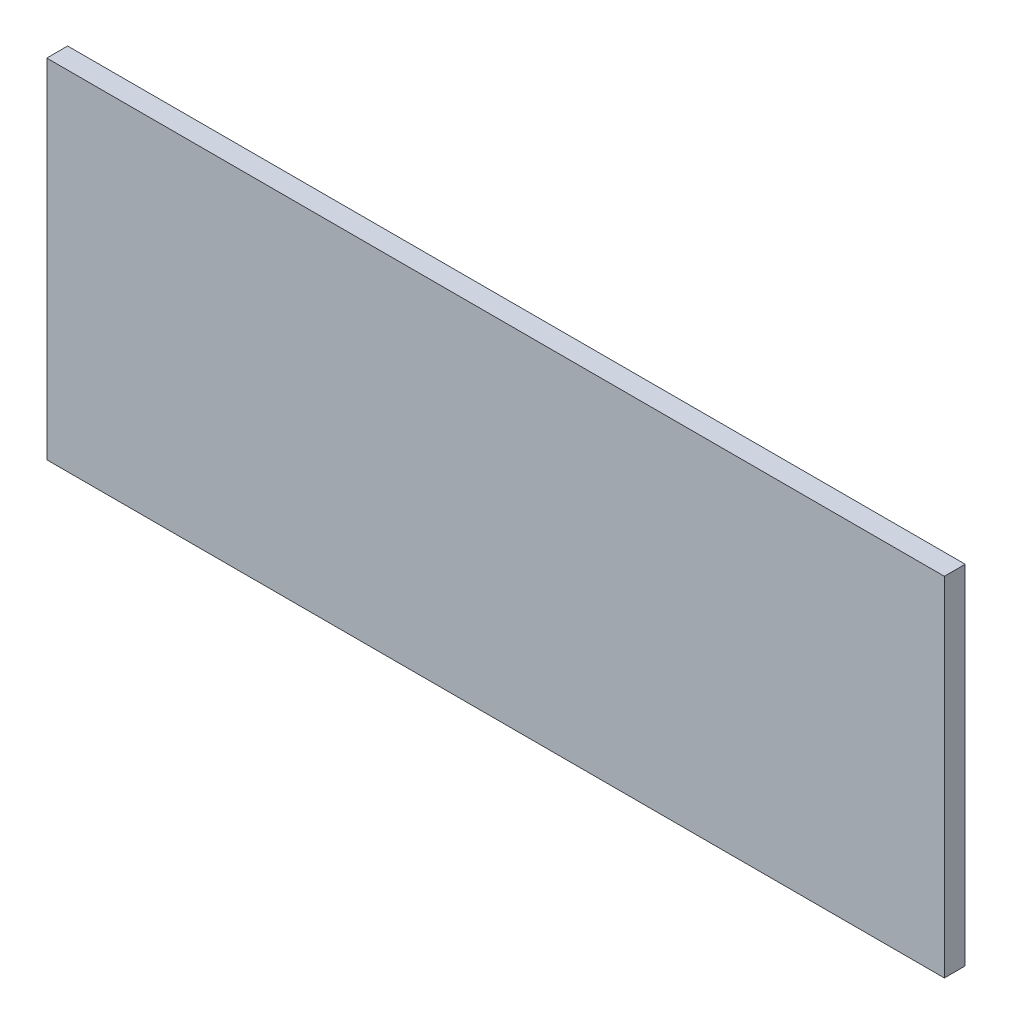
ISO-10303-21;
HEADER;
FILE_DESCRIPTION(('STEP AP214'),'2;1');
FILE_NAME('part.step','',(''),(''),'','','');
FILE_SCHEMA(('AUTOMOTIVE_DESIGN { 1 0 10303 214 1 1 1 1 }'));
ENDSEC;
DATA;
#1=APPLICATION_CONTEXT('core data for automotive mechanical design processes');
#2=APPLICATION_PROTOCOL_DEFINITION('international standard','automotive_design',2000,#1);
#3=PRODUCT_CONTEXT('',#1,'mechanical');
#4=PRODUCT('Part','Part','',(#3));
#5=PRODUCT_RELATED_PRODUCT_CATEGORY('part','',(#4));
#6=PRODUCT_DEFINITION_FORMATION('','',#4);
#7=PRODUCT_DEFINITION_CONTEXT('part definition',#1,'design');
#8=PRODUCT_DEFINITION('design','',#6,#7);
#9=PRODUCT_DEFINITION_SHAPE('','',#8);
#10=(LENGTH_UNIT() NAMED_UNIT(*) SI_UNIT(.MILLI.,.METRE.));
#11=(NAMED_UNIT(*) PLANE_ANGLE_UNIT() SI_UNIT($,.RADIAN.));
#12=(NAMED_UNIT(*) SI_UNIT($,.STERADIAN.) SOLID_ANGLE_UNIT());
#13=UNCERTAINTY_MEASURE_WITH_UNIT(LENGTH_MEASURE(1.E-05),#10,'distance_accuracy_value','');
#14=(GEOMETRIC_REPRESENTATION_CONTEXT(3) GLOBAL_UNCERTAINTY_ASSIGNED_CONTEXT((#13)) GLOBAL_UNIT_ASSIGNED_CONTEXT((#10,
#11,#12)) REPRESENTATION_CONTEXT('',''));
#15=CARTESIAN_POINT('',(0.,0.,0.));
#16=DIRECTION('',(0.,0.,1.));
#17=DIRECTION('',(1.,0.,0.));
#18=AXIS2_PLACEMENT_3D('',#15,#16,#17);
#19=CARTESIAN_POINT('',(-258.,0.,6.));
#20=DIRECTION('',(0.,1.,0.));
#21=DIRECTION('',(0.,0.,1.));
#22=AXIS2_PLACEMENT_3D('',#19,#20,#21);
#23=PLANE('',#22);
#24=DIRECTION('',(1.,0.,0.));
#25=VECTOR('',#24,1.);
#26=CARTESIAN_POINT('',(-258.,0.,0.));
#27=LINE('',#26,#25);
#28=CARTESIAN_POINT('',(-258.,0.,0.));
#29=VERTEX_POINT('',#28);
#30=CARTESIAN_POINT('',(0.,0.,0.));
#31=VERTEX_POINT('',#30);
#32=EDGE_CURVE('E96',#29,#31,#27,.T.);
#33=ORIENTED_EDGE('',*,*,#32,.T.);
#34=DIRECTION('',(0.,0.,-1.));
#35=VECTOR('',#34,1.);
#36=CARTESIAN_POINT('',(0.,0.,6.));
#37=LINE('',#36,#35);
#38=CARTESIAN_POINT('',(0.,0.,6.));
#39=VERTEX_POINT('',#38);
#40=EDGE_CURVE('E11',#39,#31,#37,.T.);
#41=ORIENTED_EDGE('',*,*,#40,.F.);
#42=DIRECTION('',(1.,0.,0.));
#43=VECTOR('',#42,1.);
#44=CARTESIAN_POINT('',(-258.,0.,6.));
#45=LINE('',#44,#43);
#46=CARTESIAN_POINT('',(-258.,0.,6.));
#47=VERTEX_POINT('',#46);
#48=EDGE_CURVE('E84',#47,#39,#45,.T.);
#49=ORIENTED_EDGE('',*,*,#48,.F.);
#50=DIRECTION('',(0.,0.,-1.));
#51=VECTOR('',#50,1.);
#52=CARTESIAN_POINT('',(-258.,0.,6.));
#53=LINE('',#52,#51);
#54=EDGE_CURVE('E92',#47,#29,#53,.T.);
#55=ORIENTED_EDGE('',*,*,#54,.T.);
#56=EDGE_LOOP('',(#33,#41,#49,#55));
#57=FACE_BOUND('',#56,.T.);
#58=ADVANCED_FACE('F33',(#57),#23,.F.);
#59=CARTESIAN_POINT('',(0.,0.,6.));
#60=DIRECTION('',(-1.,0.,0.));
#61=DIRECTION('',(0.,0.,1.));
#62=AXIS2_PLACEMENT_3D('',#59,#60,#61);
#63=PLANE('',#62);
#64=DIRECTION('',(0.,1.,0.));
#65=VECTOR('',#64,1.);
#66=CARTESIAN_POINT('',(0.,0.,0.));
#67=LINE('',#66,#65);
#68=CARTESIAN_POINT('',(0.,100.,0.));
#69=VERTEX_POINT('',#68);
#70=EDGE_CURVE('E88',#31,#69,#67,.T.);
#71=ORIENTED_EDGE('',*,*,#70,.T.);
#72=DIRECTION('',(0.,0.,-1.));
#73=VECTOR('',#72,1.);
#74=CARTESIAN_POINT('',(0.,100.,6.));
#75=LINE('',#74,#73);
#76=CARTESIAN_POINT('',(0.,100.,6.));
#77=VERTEX_POINT('',#76);
#78=EDGE_CURVE('E41',#77,#69,#75,.T.);
#79=ORIENTED_EDGE('',*,*,#78,.F.);
#80=DIRECTION('',(0.,1.,0.));
#81=VECTOR('',#80,1.);
#82=CARTESIAN_POINT('',(0.,0.,6.));
#83=LINE('',#82,#81);
#84=EDGE_CURVE('E79',#39,#77,#83,.T.);
#85=ORIENTED_EDGE('',*,*,#84,.F.);
#86=ORIENTED_EDGE('',*,*,#40,.T.);
#87=EDGE_LOOP('',(#71,#79,#85,#86));
#88=FACE_BOUND('',#87,.T.);
#89=ADVANCED_FACE('F87',(#88),#63,.F.);
#90=CARTESIAN_POINT('',(0.,100.,6.));
#91=DIRECTION('',(0.,-1.,0.));
#92=DIRECTION('',(0.,0.,-1.));
#93=AXIS2_PLACEMENT_3D('',#90,#91,#92);
#94=PLANE('',#93);
#95=DIRECTION('',(-1.,0.,0.));
#96=VECTOR('',#95,1.);
#97=CARTESIAN_POINT('',(0.,100.,0.));
#98=LINE('',#97,#96);
#99=CARTESIAN_POINT('',(-258.,100.,0.));
#100=VERTEX_POINT('',#99);
#101=EDGE_CURVE('E66',#69,#100,#98,.T.);
#102=ORIENTED_EDGE('',*,*,#101,.T.);
#103=DIRECTION('',(0.,0.,-1.));
#104=VECTOR('',#103,1.);
#105=CARTESIAN_POINT('',(-258.,100.,6.));
#106=LINE('',#105,#104);
#107=CARTESIAN_POINT('',(-258.,100.,6.));
#108=VERTEX_POINT('',#107);
#109=EDGE_CURVE('E89',#108,#100,#106,.T.);
#110=ORIENTED_EDGE('',*,*,#109,.F.);
#111=DIRECTION('',(-1.,0.,0.));
#112=VECTOR('',#111,1.);
#113=CARTESIAN_POINT('',(0.,100.,6.));
#114=LINE('',#113,#112);
#115=EDGE_CURVE('E82',#77,#108,#114,.T.);
#116=ORIENTED_EDGE('',*,*,#115,.F.);
#117=ORIENTED_EDGE('',*,*,#78,.T.);
#118=EDGE_LOOP('',(#102,#110,#116,#117));
#119=FACE_BOUND('',#118,.T.);
#120=ADVANCED_FACE('F90',(#119),#94,.F.);
#121=CARTESIAN_POINT('',(-258.,100.,6.));
#122=DIRECTION('',(1.,0.,0.));
#123=DIRECTION('',(0.,0.,-1.));
#124=AXIS2_PLACEMENT_3D('',#121,#122,#123);
#125=PLANE('',#124);
#126=DIRECTION('',(0.,-1.,0.));
#127=VECTOR('',#126,1.);
#128=CARTESIAN_POINT('',(-258.,100.,0.));
#129=LINE('',#128,#127);
#130=EDGE_CURVE('E72',#100,#29,#129,.T.);
#131=ORIENTED_EDGE('',*,*,#130,.T.);
#132=ORIENTED_EDGE('',*,*,#54,.F.);
#133=DIRECTION('',(0.,-1.,0.));
#134=VECTOR('',#133,1.);
#135=CARTESIAN_POINT('',(-258.,100.,6.));
#136=LINE('',#135,#134);
#137=EDGE_CURVE('E49',#108,#47,#136,.T.);
#138=ORIENTED_EDGE('',*,*,#137,.F.);
#139=ORIENTED_EDGE('',*,*,#109,.T.);
#140=EDGE_LOOP('',(#131,#132,#138,#139));
#141=FACE_BOUND('',#140,.T.);
#142=ADVANCED_FACE('F103',(#141),#125,.F.);
#143=CARTESIAN_POINT('',(0.,0.,6.));
#144=DIRECTION('',(0.,0.,1.));
#145=DIRECTION('',(1.,0.,0.));
#146=AXIS2_PLACEMENT_3D('',#143,#144,#145);
#147=PLANE('',#146);
#148=ORIENTED_EDGE('',*,*,#48,.T.);
#149=ORIENTED_EDGE('',*,*,#84,.T.);
#150=ORIENTED_EDGE('',*,*,#115,.T.);
#151=ORIENTED_EDGE('',*,*,#137,.T.);
#152=EDGE_LOOP('',(#148,#149,#150,#151));
#153=FACE_BOUND('',#152,.T.);
#154=ADVANCED_FACE('F80',(#153),#147,.T.);
#155=CARTESIAN_POINT('',(0.,0.,0.));
#156=DIRECTION('',(0.,0.,1.));
#157=DIRECTION('',(1.,0.,0.));
#158=AXIS2_PLACEMENT_3D('',#155,#156,#157);
#159=PLANE('',#158);
#160=ORIENTED_EDGE('',*,*,#32,.F.);
#161=ORIENTED_EDGE('',*,*,#130,.F.);
#162=ORIENTED_EDGE('',*,*,#101,.F.);
#163=ORIENTED_EDGE('',*,*,#70,.F.);
#164=EDGE_LOOP('',(#160,#161,#162,#163));
#165=FACE_BOUND('',#164,.T.);
#166=ADVANCED_FACE('F106',(#165),#159,.F.);
#167=CLOSED_SHELL('',(#58,#89,#120,#142,#154,#166));
#168=MANIFOLD_SOLID_BREP('B2',#167);
#169=ADVANCED_BREP_SHAPE_REPRESENTATION('',(#18,#168),#14);
#170=SHAPE_DEFINITION_REPRESENTATION(#9,#169);
ENDSEC;
END-ISO-10303-21;
